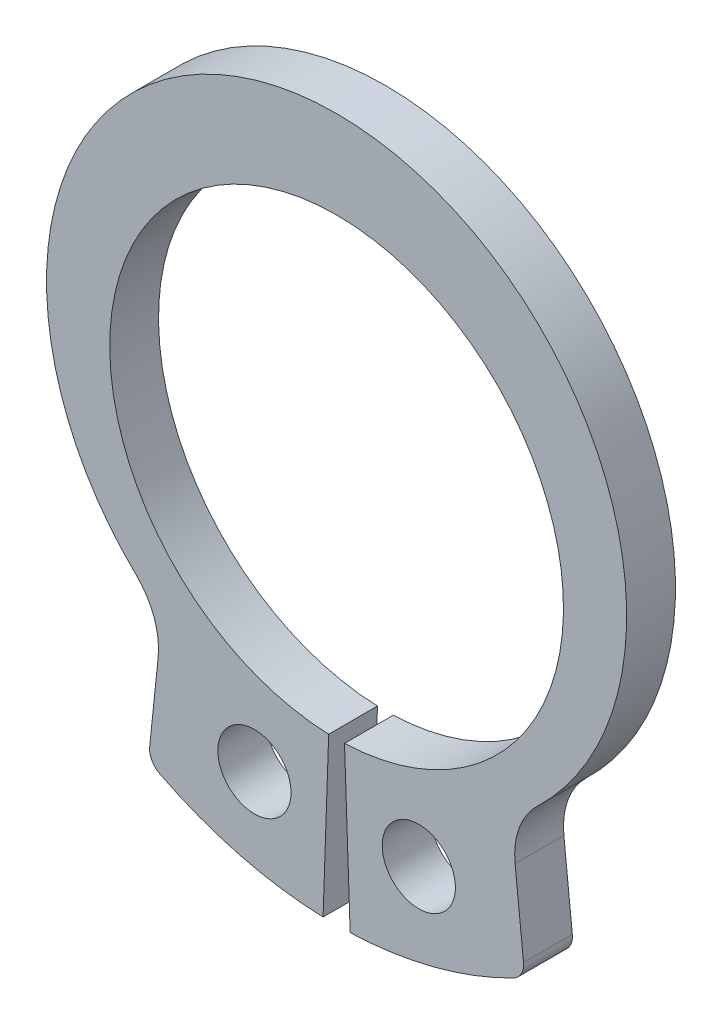
ISO-10303-21;
HEADER;
FILE_DESCRIPTION(('STEP AP214'),'2;1');
FILE_NAME('part.step','',(''),(''),'','','');
FILE_SCHEMA(('AUTOMOTIVE_DESIGN { 1 0 10303 214 1 1 1 1 }'));
ENDSEC;
DATA;
#1=APPLICATION_CONTEXT('core data for automotive mechanical design processes');
#2=APPLICATION_PROTOCOL_DEFINITION('international standard','automotive_design',2000,#1);
#3=PRODUCT_CONTEXT('',#1,'mechanical');
#4=PRODUCT('Part','Part','',(#3));
#5=PRODUCT_RELATED_PRODUCT_CATEGORY('part','',(#4));
#6=PRODUCT_DEFINITION_FORMATION('','',#4);
#7=PRODUCT_DEFINITION_CONTEXT('part definition',#1,'design');
#8=PRODUCT_DEFINITION('design','',#6,#7);
#9=PRODUCT_DEFINITION_SHAPE('','',#8);
#10=(LENGTH_UNIT() NAMED_UNIT(*) SI_UNIT(.MILLI.,.METRE.));
#11=(NAMED_UNIT(*) PLANE_ANGLE_UNIT() SI_UNIT($,.RADIAN.));
#12=(NAMED_UNIT(*) SI_UNIT($,.STERADIAN.) SOLID_ANGLE_UNIT());
#13=UNCERTAINTY_MEASURE_WITH_UNIT(LENGTH_MEASURE(1.E-05),#10,'distance_accuracy_value','');
#14=(GEOMETRIC_REPRESENTATION_CONTEXT(3) GLOBAL_UNCERTAINTY_ASSIGNED_CONTEXT((#13)) GLOBAL_UNIT_ASSIGNED_CONTEXT((#10,
#11,#12)) REPRESENTATION_CONTEXT('',''));
#15=CARTESIAN_POINT('',(0.,0.,0.));
#16=DIRECTION('',(0.,0.,1.));
#17=DIRECTION('',(1.,0.,0.));
#18=AXIS2_PLACEMENT_3D('',#15,#16,#17);
#19=CARTESIAN_POINT('',(0.,0.504934327126125,0.5));
#20=DIRECTION('',(0.,0.,1.));
#21=DIRECTION('',(1.,0.,0.));
#22=AXIS2_PLACEMENT_3D('',#19,#20,#21);
#23=PLANE('',#22);
#24=DIRECTION('',(-0.103368899881564,-0.994643087010248,0.));
#25=VECTOR('',#24,1.);
#26=CARTESIAN_POINT('',(-3.85778152735849,-6.95680203949989,0.5));
#27=LINE('',#26,#25);
#28=CARTESIAN_POINT('',(-3.65800533614776,-5.03450231719795,0.5));
#29=VERTEX_POINT('',#28);
#30=CARTESIAN_POINT('',(-3.83145228244631,-6.70345503214944,0.5));
#31=VERTEX_POINT('',#30);
#32=EDGE_CURVE('E193',#29,#31,#27,.T.);
#33=ORIENTED_EDGE('',*,*,#32,.T.);
#34=CARTESIAN_POINT('',(-3.45480058824215,-6.74259879313957,0.5));
#35=DIRECTION('',(0.,0.,1.));
#36=DIRECTION('',(1.,0.,0.));
#37=AXIS2_PLACEMENT_3D('',#34,#35,#36);
#38=CIRCLE('',#37,0.378680251361645);
#39=CARTESIAN_POINT('',(-3.62748223483951,-7.07961478934708,0.5));
#40=VERTEX_POINT('',#39);
#41=EDGE_CURVE('E12',#31,#40,#38,.T.);
#42=ORIENTED_EDGE('',*,*,#41,.T.);
#43=CARTESIAN_POINT('',(0.,0.,0.5));
#44=DIRECTION('',(0.,0.,1.));
#45=DIRECTION('',(1.,0.,0.));
#46=AXIS2_PLACEMENT_3D('',#43,#44,#45);
#47=CIRCLE('',#46,7.95484587717564);
#48=CARTESIAN_POINT('',(-0.277620117459407,-7.95,0.5));
#49=VERTEX_POINT('',#48);
#50=EDGE_CURVE('E196',#40,#49,#47,.T.);
#51=ORIENTED_EDGE('',*,*,#50,.T.);
#52=DIRECTION('',(0.0348994967025024,0.999390827019096,0.));
#53=VECTOR('',#52,1.);
#54=CARTESIAN_POINT('',(-0.277620117459407,-7.95,0.5));
#55=LINE('',#54,#53);
#56=CARTESIAN_POINT('',(-0.162282659666637,-4.6471673456388,0.5));
#57=VERTEX_POINT('',#56);
#58=EDGE_CURVE('E198',#49,#57,#55,.T.);
#59=ORIENTED_EDGE('',*,*,#58,.T.);
#60=CARTESIAN_POINT('',(0.,0.,0.5));
#61=DIRECTION('',(0.,0.,-1.));
#62=DIRECTION('',(1.,0.,0.));
#63=AXIS2_PLACEMENT_3D('',#60,#61,#62);
#64=CIRCLE('',#63,4.65);
#65=CARTESIAN_POINT('',(0.162282659666635,-4.6471673456388,0.5));
#66=VERTEX_POINT('',#65);
#67=EDGE_CURVE('E152',#57,#66,#64,.T.);
#68=ORIENTED_EDGE('',*,*,#67,.T.);
#69=DIRECTION('',(-0.034899496702502,0.999390827019096,0.));
#70=VECTOR('',#69,1.);
#71=CARTESIAN_POINT('',(0.277620117459404,-7.95,0.5));
#72=LINE('',#71,#70);
#73=CARTESIAN_POINT('',(0.277620117459404,-7.95,0.5));
#74=VERTEX_POINT('',#73);
#75=EDGE_CURVE('E132',#74,#66,#72,.T.);
#76=ORIENTED_EDGE('',*,*,#75,.F.);
#77=CARTESIAN_POINT('',(0.,0.,0.5));
#78=DIRECTION('',(0.,0.,-1.));
#79=DIRECTION('',(-1.,0.,0.));
#80=AXIS2_PLACEMENT_3D('',#77,#78,#79);
#81=CIRCLE('',#80,7.95484587717564);
#82=CARTESIAN_POINT('',(3.6274822348395,-7.07961478934709,0.5));
#83=VERTEX_POINT('',#82);
#84=EDGE_CURVE('E142',#83,#74,#81,.T.);
#85=ORIENTED_EDGE('',*,*,#84,.F.);
#86=CARTESIAN_POINT('',(3.45480058824214,-6.74259879313957,0.5));
#87=DIRECTION('',(0.,0.,-1.));
#88=DIRECTION('',(-1.,0.,0.));
#89=AXIS2_PLACEMENT_3D('',#86,#87,#88);
#90=CIRCLE('',#89,0.378680251361645);
#91=CARTESIAN_POINT('',(3.83145228244631,-6.70345503214945,0.5));
#92=VERTEX_POINT('',#91);
#93=EDGE_CURVE('E181',#92,#83,#90,.T.);
#94=ORIENTED_EDGE('',*,*,#93,.F.);
#95=DIRECTION('',(0.103368899881564,-0.994643087010248,0.));
#96=VECTOR('',#95,1.);
#97=CARTESIAN_POINT('',(3.85778152735849,-6.95680203949989,0.5));
#98=LINE('',#97,#96);
#99=CARTESIAN_POINT('',(3.65800533614776,-5.03450231719795,0.5));
#100=VERTEX_POINT('',#99);
#101=EDGE_CURVE('E148',#100,#92,#98,.T.);
#102=ORIENTED_EDGE('',*,*,#101,.F.);
#103=CARTESIAN_POINT('',(5.16461211296441,-4.87792727323744,0.5));
#104=DIRECTION('',(0.,0.,-1.));
#105=DIRECTION('',(-1.,0.,0.));
#106=AXIS2_PLACEMENT_3D('',#103,#104,#105);
#107=CIRCLE('',#106,1.51472100544658);
#108=CARTESIAN_POINT('',(4.11592978599842,-3.78492905665597,0.5));
#109=VERTEX_POINT('',#108);
#110=EDGE_CURVE('E172',#109,#100,#107,.F.);
#111=ORIENTED_EDGE('',*,*,#110,.F.);
#112=CARTESIAN_POINT('',(0.,0.504934327126125,0.5));
#113=DIRECTION('',(0.,0.,1.));
#114=DIRECTION('',(1.,0.,0.));
#115=AXIS2_PLACEMENT_3D('',#112,#113,#114);
#116=CIRCLE('',#115,5.94506567287388);
#117=CARTESIAN_POINT('',(-4.11592978599842,-3.78492905665597,0.5));
#118=VERTEX_POINT('',#117);
#119=EDGE_CURVE('E190',#109,#118,#116,.T.);
#120=ORIENTED_EDGE('',*,*,#119,.T.);
#121=CARTESIAN_POINT('',(-5.16461211296442,-4.87792727323744,0.5));
#122=DIRECTION('',(0.,0.,1.));
#123=DIRECTION('',(1.,0.,0.));
#124=AXIS2_PLACEMENT_3D('',#121,#122,#123);
#125=CIRCLE('',#124,1.51472100544658);
#126=EDGE_CURVE('E223',#118,#29,#125,.F.);
#127=ORIENTED_EDGE('',*,*,#126,.T.);
#128=EDGE_LOOP('',(#33,#42,#51,#59,#68,#76,#85,#94,#102,#111,#120,#127));
#129=FACE_BOUND('',#128,.T.);
#130=CARTESIAN_POINT('',(-1.68477116451144,-6.0730619147238,0.5));
#131=DIRECTION('',(0.,0.,1.));
#132=DIRECTION('',(1.,0.,0.));
#133=AXIS2_PLACEMENT_3D('',#130,#131,#132);
#134=CIRCLE('',#133,0.75);
#135=CARTESIAN_POINT('',(-0.934771164511438,-6.0730619147238,0.5));
#136=VERTEX_POINT('',#135);
#137=EDGE_CURVE('E184',#136,#136,#134,.T.);
#138=ORIENTED_EDGE('',*,*,#137,.F.);
#139=EDGE_LOOP('',(#138));
#140=FACE_BOUND('',#139,.T.);
#141=CARTESIAN_POINT('',(1.68477116451144,-6.0730619147238,0.5));
#142=DIRECTION('',(0.,0.,-1.));
#143=DIRECTION('',(-1.,0.,0.));
#144=AXIS2_PLACEMENT_3D('',#141,#142,#143);
#145=CIRCLE('',#144,0.75);
#146=CARTESIAN_POINT('',(0.934771164511436,-6.0730619147238,0.5));
#147=VERTEX_POINT('',#146);
#148=EDGE_CURVE('E162',#147,#147,#145,.T.);
#149=ORIENTED_EDGE('',*,*,#148,.T.);
#150=EDGE_LOOP('',(#149));
#151=FACE_BOUND('',#150,.T.);
#152=ADVANCED_FACE('F38',(#129,#140,#151),#23,.T.);
#153=CARTESIAN_POINT('',(0.,0.504934327126125,-0.5));
#154=DIRECTION('',(0.,0.,1.));
#155=DIRECTION('',(1.,0.,0.));
#156=AXIS2_PLACEMENT_3D('',#153,#154,#155);
#157=PLANE('',#156);
#158=CARTESIAN_POINT('',(0.,0.,-0.5));
#159=DIRECTION('',(0.,0.,1.));
#160=DIRECTION('',(1.,0.,0.));
#161=AXIS2_PLACEMENT_3D('',#158,#159,#160);
#162=CIRCLE('',#161,7.95484587717564);
#163=CARTESIAN_POINT('',(-3.62748223483951,-7.07961478934708,-0.5));
#164=VERTEX_POINT('',#163);
#165=CARTESIAN_POINT('',(-0.277620117459407,-7.95,-0.5));
#166=VERTEX_POINT('',#165);
#167=EDGE_CURVE('E206',#164,#166,#162,.T.);
#168=ORIENTED_EDGE('',*,*,#167,.F.);
#169=CARTESIAN_POINT('',(-3.45480058824215,-6.74259879313957,-0.5));
#170=DIRECTION('',(0.,0.,1.));
#171=DIRECTION('',(1.,0.,0.));
#172=AXIS2_PLACEMENT_3D('',#169,#170,#171);
#173=CIRCLE('',#172,0.378680251361645);
#174=CARTESIAN_POINT('',(-3.83145228244631,-6.70345503214944,-0.5));
#175=VERTEX_POINT('',#174);
#176=EDGE_CURVE('E60',#164,#175,#173,.F.);
#177=ORIENTED_EDGE('',*,*,#176,.T.);
#178=DIRECTION('',(-0.103368899881564,-0.994643087010248,0.));
#179=VECTOR('',#178,1.);
#180=CARTESIAN_POINT('',(-3.85778152735849,-6.95680203949989,-0.5));
#181=LINE('',#180,#179);
#182=CARTESIAN_POINT('',(-3.65800533614776,-5.03450231719795,-0.5));
#183=VERTEX_POINT('',#182);
#184=EDGE_CURVE('E204',#183,#175,#181,.T.);
#185=ORIENTED_EDGE('',*,*,#184,.F.);
#186=CARTESIAN_POINT('',(-5.16461211296442,-4.87792727323744,-0.5));
#187=DIRECTION('',(0.,0.,1.));
#188=DIRECTION('',(1.,0.,0.));
#189=AXIS2_PLACEMENT_3D('',#186,#187,#188);
#190=CIRCLE('',#189,1.51472100544658);
#191=CARTESIAN_POINT('',(-4.11592978599842,-3.78492905665597,-0.5));
#192=VERTEX_POINT('',#191);
#193=EDGE_CURVE('E221',#183,#192,#190,.T.);
#194=ORIENTED_EDGE('',*,*,#193,.T.);
#195=CARTESIAN_POINT('',(0.,0.504934327126125,-0.5));
#196=DIRECTION('',(0.,0.,1.));
#197=DIRECTION('',(1.,0.,0.));
#198=AXIS2_PLACEMENT_3D('',#195,#196,#197);
#199=CIRCLE('',#198,5.94506567287388);
#200=CARTESIAN_POINT('',(4.11592978599842,-3.78492905665597,-0.5));
#201=VERTEX_POINT('',#200);
#202=EDGE_CURVE('E187',#201,#192,#199,.T.);
#203=ORIENTED_EDGE('',*,*,#202,.F.);
#204=CARTESIAN_POINT('',(5.16461211296441,-4.87792727323744,-0.5));
#205=DIRECTION('',(0.,0.,-1.));
#206=DIRECTION('',(-1.,0.,0.));
#207=AXIS2_PLACEMENT_3D('',#204,#205,#206);
#208=CIRCLE('',#207,1.51472100544658);
#209=CARTESIAN_POINT('',(3.65800533614776,-5.03450231719795,-0.5));
#210=VERTEX_POINT('',#209);
#211=EDGE_CURVE('E169',#210,#201,#208,.T.);
#212=ORIENTED_EDGE('',*,*,#211,.F.);
#213=DIRECTION('',(0.103368899881564,-0.994643087010248,0.));
#214=VECTOR('',#213,1.);
#215=CARTESIAN_POINT('',(3.85778152735849,-6.95680203949989,-0.5));
#216=LINE('',#215,#214);
#217=CARTESIAN_POINT('',(3.83145228244631,-6.70345503214945,-0.5));
#218=VERTEX_POINT('',#217);
#219=EDGE_CURVE('E158',#210,#218,#216,.T.);
#220=ORIENTED_EDGE('',*,*,#219,.T.);
#221=CARTESIAN_POINT('',(3.45480058824214,-6.74259879313957,-0.5));
#222=DIRECTION('',(0.,0.,-1.));
#223=DIRECTION('',(-1.,0.,0.));
#224=AXIS2_PLACEMENT_3D('',#221,#222,#223);
#225=CIRCLE('',#224,0.378680251361645);
#226=CARTESIAN_POINT('',(3.6274822348395,-7.07961478934709,-0.5));
#227=VERTEX_POINT('',#226);
#228=EDGE_CURVE('E176',#227,#218,#225,.F.);
#229=ORIENTED_EDGE('',*,*,#228,.F.);
#230=CARTESIAN_POINT('',(0.,0.,-0.5));
#231=DIRECTION('',(0.,0.,-1.));
#232=DIRECTION('',(-1.,0.,0.));
#233=AXIS2_PLACEMENT_3D('',#230,#231,#232);
#234=CIRCLE('',#233,7.95484587717564);
#235=CARTESIAN_POINT('',(0.277620117459404,-7.95,-0.5));
#236=VERTEX_POINT('',#235);
#237=EDGE_CURVE('E161',#227,#236,#234,.T.);
#238=ORIENTED_EDGE('',*,*,#237,.T.);
#239=DIRECTION('',(-0.034899496702502,0.999390827019096,0.));
#240=VECTOR('',#239,1.);
#241=CARTESIAN_POINT('',(0.277620117459404,-7.95,-0.5));
#242=LINE('',#241,#240);
#243=CARTESIAN_POINT('',(0.162282659666635,-4.6471673456388,-0.5));
#244=VERTEX_POINT('',#243);
#245=EDGE_CURVE('E134',#236,#244,#242,.T.);
#246=ORIENTED_EDGE('',*,*,#245,.T.);
#247=CARTESIAN_POINT('',(0.,0.,-0.5));
#248=DIRECTION('',(0.,0.,-1.));
#249=DIRECTION('',(1.,0.,0.));
#250=AXIS2_PLACEMENT_3D('',#247,#248,#249);
#251=CIRCLE('',#250,4.65);
#252=CARTESIAN_POINT('',(-0.162282659666637,-4.6471673456388,-0.5));
#253=VERTEX_POINT('',#252);
#254=EDGE_CURVE('E194',#253,#244,#251,.T.);
#255=ORIENTED_EDGE('',*,*,#254,.F.);
#256=DIRECTION('',(0.0348994967025024,0.999390827019096,0.));
#257=VECTOR('',#256,1.);
#258=CARTESIAN_POINT('',(-0.277620117459407,-7.95,-0.5));
#259=LINE('',#258,#257);
#260=EDGE_CURVE('E208',#166,#253,#259,.T.);
#261=ORIENTED_EDGE('',*,*,#260,.F.);
#262=EDGE_LOOP('',(#168,#177,#185,#194,#203,#212,#220,#229,#238,#246,#255,#261));
#263=FACE_BOUND('',#262,.T.);
#264=CARTESIAN_POINT('',(-1.68477116451144,-6.0730619147238,-0.5));
#265=DIRECTION('',(0.,0.,1.));
#266=DIRECTION('',(1.,0.,0.));
#267=AXIS2_PLACEMENT_3D('',#264,#265,#266);
#268=CIRCLE('',#267,0.75);
#269=CARTESIAN_POINT('',(-0.934771164511438,-6.0730619147238,-0.5));
#270=VERTEX_POINT('',#269);
#271=EDGE_CURVE('E183',#270,#270,#268,.T.);
#272=ORIENTED_EDGE('',*,*,#271,.T.);
#273=EDGE_LOOP('',(#272));
#274=FACE_BOUND('',#273,.T.);
#275=CARTESIAN_POINT('',(1.68477116451144,-6.0730619147238,-0.5));
#276=DIRECTION('',(0.,0.,-1.));
#277=DIRECTION('',(-1.,0.,0.));
#278=AXIS2_PLACEMENT_3D('',#275,#276,#277);
#279=CIRCLE('',#278,0.75);
#280=CARTESIAN_POINT('',(0.934771164511436,-6.0730619147238,-0.5));
#281=VERTEX_POINT('',#280);
#282=EDGE_CURVE('E256',#281,#281,#279,.T.);
#283=ORIENTED_EDGE('',*,*,#282,.F.);
#284=EDGE_LOOP('',(#283));
#285=FACE_BOUND('',#284,.T.);
#286=ADVANCED_FACE('F236',(#263,#274,#285),#157,.F.);
#287=CARTESIAN_POINT('',(0.,0.504934327126125,0.5));
#288=DIRECTION('',(0.,0.,-1.));
#289=DIRECTION('',(-1.,0.,0.));
#290=AXIS2_PLACEMENT_3D('',#287,#288,#289);
#291=CYLINDRICAL_SURFACE('',#290,5.94506567287388);
#292=ORIENTED_EDGE('',*,*,#202,.T.);
#293=DIRECTION('',(0.,0.,-1.));
#294=VECTOR('',#293,1.);
#295=CARTESIAN_POINT('',(-4.11592978599842,-3.78492905665597,0.5));
#296=LINE('',#295,#294);
#297=EDGE_CURVE('E219',#192,#118,#296,.F.);
#298=ORIENTED_EDGE('',*,*,#297,.T.);
#299=ORIENTED_EDGE('',*,*,#119,.F.);
#300=DIRECTION('',(0.,0.,-1.));
#301=VECTOR('',#300,1.);
#302=CARTESIAN_POINT('',(4.11592978599842,-3.78492905665597,0.5));
#303=LINE('',#302,#301);
#304=EDGE_CURVE('E166',#201,#109,#303,.F.);
#305=ORIENTED_EDGE('',*,*,#304,.F.);
#306=EDGE_LOOP('',(#292,#298,#299,#305));
#307=FACE_BOUND('',#306,.T.);
#308=ADVANCED_FACE('F271',(#307),#291,.T.);
#309=CARTESIAN_POINT('',(-3.85778152735849,-6.95680203949989,0.5));
#310=DIRECTION('',(0.994643087010248,-0.103368899881564,0.));
#311=DIRECTION('',(0.103368899881564,0.994643087010248,0.));
#312=AXIS2_PLACEMENT_3D('',#309,#310,#311);
#313=PLANE('',#312);
#314=ORIENTED_EDGE('',*,*,#184,.T.);
#315=DIRECTION('',(0.,0.,-1.));
#316=VECTOR('',#315,1.);
#317=CARTESIAN_POINT('',(-3.83145228244631,-6.70345503214944,0.5));
#318=LINE('',#317,#316);
#319=EDGE_CURVE('E46',#175,#31,#318,.F.);
#320=ORIENTED_EDGE('',*,*,#319,.T.);
#321=ORIENTED_EDGE('',*,*,#32,.F.);
#322=DIRECTION('',(0.,0.,1.));
#323=VECTOR('',#322,1.);
#324=CARTESIAN_POINT('',(-3.65800533614776,-5.03450231719795,-0.5));
#325=LINE('',#324,#323);
#326=EDGE_CURVE('E216',#29,#183,#325,.F.);
#327=ORIENTED_EDGE('',*,*,#326,.T.);
#328=EDGE_LOOP('',(#314,#320,#321,#327));
#329=FACE_BOUND('',#328,.T.);
#330=ADVANCED_FACE('F277',(#329),#313,.F.);
#331=CARTESIAN_POINT('',(0.,0.,0.5));
#332=DIRECTION('',(0.,0.,-1.));
#333=DIRECTION('',(-1.,0.,0.));
#334=AXIS2_PLACEMENT_3D('',#331,#332,#333);
#335=CYLINDRICAL_SURFACE('',#334,7.95484587717564);
#336=ORIENTED_EDGE('',*,*,#50,.F.);
#337=DIRECTION('',(0.,0.,-1.));
#338=VECTOR('',#337,1.);
#339=CARTESIAN_POINT('',(-3.62748223483951,-7.07961478934709,0.5));
#340=LINE('',#339,#338);
#341=EDGE_CURVE('E225',#40,#164,#340,.T.);
#342=ORIENTED_EDGE('',*,*,#341,.T.);
#343=ORIENTED_EDGE('',*,*,#167,.T.);
#344=DIRECTION('',(0.,0.,-1.));
#345=VECTOR('',#344,1.);
#346=CARTESIAN_POINT('',(-0.277620117459407,-7.95,0.5));
#347=LINE('',#346,#345);
#348=EDGE_CURVE('E213',#49,#166,#347,.T.);
#349=ORIENTED_EDGE('',*,*,#348,.F.);
#350=EDGE_LOOP('',(#336,#342,#343,#349));
#351=FACE_BOUND('',#350,.T.);
#352=ADVANCED_FACE('F231',(#351),#335,.T.);
#353=CARTESIAN_POINT('',(-0.277620117459407,-7.95,0.5));
#354=DIRECTION('',(-0.999390827019096,0.0348994967025024,0.));
#355=DIRECTION('',(-0.0348994967025024,-0.999390827019096,0.));
#356=AXIS2_PLACEMENT_3D('',#353,#354,#355);
#357=PLANE('',#356);
#358=ORIENTED_EDGE('',*,*,#260,.T.);
#359=DIRECTION('',(0.,0.,-1.));
#360=VECTOR('',#359,1.);
#361=CARTESIAN_POINT('',(-0.162282659666637,-4.6471673456388,0.5));
#362=LINE('',#361,#360);
#363=EDGE_CURVE('E201',#57,#253,#362,.T.);
#364=ORIENTED_EDGE('',*,*,#363,.F.);
#365=ORIENTED_EDGE('',*,*,#58,.F.);
#366=ORIENTED_EDGE('',*,*,#348,.T.);
#367=EDGE_LOOP('',(#358,#364,#365,#366));
#368=FACE_BOUND('',#367,.T.);
#369=ADVANCED_FACE('F241',(#368),#357,.F.);
#370=CARTESIAN_POINT('',(0.,0.,0.5));
#371=DIRECTION('',(0.,0.,-1.));
#372=DIRECTION('',(-1.,0.,0.));
#373=AXIS2_PLACEMENT_3D('',#370,#371,#372);
#374=CYLINDRICAL_SURFACE('',#373,4.65);
#375=ORIENTED_EDGE('',*,*,#254,.T.);
#376=DIRECTION('',(0.,0.,-1.));
#377=VECTOR('',#376,1.);
#378=CARTESIAN_POINT('',(0.162282659666635,-4.6471673456388,0.5));
#379=LINE('',#378,#377);
#380=EDGE_CURVE('E139',#66,#244,#379,.T.);
#381=ORIENTED_EDGE('',*,*,#380,.F.);
#382=ORIENTED_EDGE('',*,*,#67,.F.);
#383=ORIENTED_EDGE('',*,*,#363,.T.);
#384=EDGE_LOOP('',(#375,#381,#382,#383));
#385=FACE_BOUND('',#384,.T.);
#386=ADVANCED_FACE('F244',(#385),#374,.F.);
#387=CARTESIAN_POINT('',(-1.68477116451144,-6.0730619147238,0.5));
#388=DIRECTION('',(0.,0.,-1.));
#389=DIRECTION('',(-1.,0.,0.));
#390=AXIS2_PLACEMENT_3D('',#387,#388,#389);
#391=CYLINDRICAL_SURFACE('',#390,0.75);
#392=ORIENTED_EDGE('',*,*,#137,.T.);
#393=EDGE_LOOP('',(#392));
#394=FACE_BOUND('',#393,.T.);
#395=ORIENTED_EDGE('',*,*,#271,.F.);
#396=EDGE_LOOP('',(#395));
#397=FACE_BOUND('',#396,.T.);
#398=ADVANCED_FACE('F285',(#394,#397),#391,.F.);
#399=CARTESIAN_POINT('',(-5.16461211296442,-4.87792727323744,0.5));
#400=DIRECTION('',(0.,0.,-1.));
#401=DIRECTION('',(-1.,0.,0.));
#402=AXIS2_PLACEMENT_3D('',#399,#400,#401);
#403=CYLINDRICAL_SURFACE('',#402,1.51472100544658);
#404=ORIENTED_EDGE('',*,*,#126,.F.);
#405=ORIENTED_EDGE('',*,*,#297,.F.);
#406=ORIENTED_EDGE('',*,*,#193,.F.);
#407=ORIENTED_EDGE('',*,*,#326,.F.);
#408=EDGE_LOOP('',(#404,#405,#406,#407));
#409=FACE_BOUND('',#408,.T.);
#410=ADVANCED_FACE('F291',(#409),#403,.F.);
#411=CARTESIAN_POINT('',(-3.45480058824215,-6.74259879313957,0.5));
#412=DIRECTION('',(0.,0.,-1.));
#413=DIRECTION('',(-1.,0.,0.));
#414=AXIS2_PLACEMENT_3D('',#411,#412,#413);
#415=CYLINDRICAL_SURFACE('',#414,0.378680251361645);
#416=ORIENTED_EDGE('',*,*,#41,.F.);
#417=ORIENTED_EDGE('',*,*,#319,.F.);
#418=ORIENTED_EDGE('',*,*,#176,.F.);
#419=ORIENTED_EDGE('',*,*,#341,.F.);
#420=EDGE_LOOP('',(#416,#417,#418,#419));
#421=FACE_BOUND('',#420,.T.);
#422=ADVANCED_FACE('F40',(#421),#415,.T.);
#423=CARTESIAN_POINT('',(3.85778152735849,-6.95680203949989,0.5));
#424=DIRECTION('',(-0.994643087010248,-0.103368899881564,0.));
#425=DIRECTION('',(-0.103368899881564,0.994643087010248,0.));
#426=AXIS2_PLACEMENT_3D('',#423,#424,#425);
#427=PLANE('',#426);
#428=ORIENTED_EDGE('',*,*,#219,.F.);
#429=DIRECTION('',(0.,0.,1.));
#430=VECTOR('',#429,1.);
#431=CARTESIAN_POINT('',(3.65800533614776,-5.03450231719795,-0.5));
#432=LINE('',#431,#430);
#433=EDGE_CURVE('E138',#100,#210,#432,.F.);
#434=ORIENTED_EDGE('',*,*,#433,.F.);
#435=ORIENTED_EDGE('',*,*,#101,.T.);
#436=DIRECTION('',(0.,0.,-1.));
#437=VECTOR('',#436,1.);
#438=CARTESIAN_POINT('',(3.83145228244631,-6.70345503214945,0.5));
#439=LINE('',#438,#437);
#440=EDGE_CURVE('E179',#218,#92,#439,.F.);
#441=ORIENTED_EDGE('',*,*,#440,.F.);
#442=EDGE_LOOP('',(#428,#434,#435,#441));
#443=FACE_BOUND('',#442,.T.);
#444=ADVANCED_FACE('F254',(#443),#427,.F.);
#445=CARTESIAN_POINT('',(0.,0.,0.5));
#446=DIRECTION('',(0.,0.,-1.));
#447=DIRECTION('',(1.,0.,0.));
#448=AXIS2_PLACEMENT_3D('',#445,#446,#447);
#449=CYLINDRICAL_SURFACE('',#448,7.95484587717564);
#450=ORIENTED_EDGE('',*,*,#84,.T.);
#451=DIRECTION('',(0.,0.,-1.));
#452=VECTOR('',#451,1.);
#453=CARTESIAN_POINT('',(0.277620117459404,-7.95,0.5));
#454=LINE('',#453,#452);
#455=EDGE_CURVE('E127',#74,#236,#454,.T.);
#456=ORIENTED_EDGE('',*,*,#455,.T.);
#457=ORIENTED_EDGE('',*,*,#237,.F.);
#458=DIRECTION('',(0.,0.,-1.));
#459=VECTOR('',#458,1.);
#460=CARTESIAN_POINT('',(3.62748223483951,-7.07961478934709,0.5));
#461=LINE('',#460,#459);
#462=EDGE_CURVE('E144',#83,#227,#461,.T.);
#463=ORIENTED_EDGE('',*,*,#462,.F.);
#464=EDGE_LOOP('',(#450,#456,#457,#463));
#465=FACE_BOUND('',#464,.T.);
#466=ADVANCED_FACE('F143',(#465),#449,.T.);
#467=CARTESIAN_POINT('',(0.277620117459404,-7.95,0.5));
#468=DIRECTION('',(0.999390827019096,0.034899496702502,0.));
#469=DIRECTION('',(0.034899496702502,-0.999390827019096,0.));
#470=AXIS2_PLACEMENT_3D('',#467,#468,#469);
#471=PLANE('',#470);
#472=ORIENTED_EDGE('',*,*,#245,.F.);
#473=ORIENTED_EDGE('',*,*,#455,.F.);
#474=ORIENTED_EDGE('',*,*,#75,.T.);
#475=ORIENTED_EDGE('',*,*,#380,.T.);
#476=EDGE_LOOP('',(#472,#473,#474,#475));
#477=FACE_BOUND('',#476,.T.);
#478=ADVANCED_FACE('F129',(#477),#471,.F.);
#479=CARTESIAN_POINT('',(1.68477116451144,-6.0730619147238,0.5));
#480=DIRECTION('',(0.,0.,-1.));
#481=DIRECTION('',(1.,0.,0.));
#482=AXIS2_PLACEMENT_3D('',#479,#480,#481);
#483=CYLINDRICAL_SURFACE('',#482,0.75);
#484=ORIENTED_EDGE('',*,*,#148,.F.);
#485=EDGE_LOOP('',(#484));
#486=FACE_BOUND('',#485,.T.);
#487=ORIENTED_EDGE('',*,*,#282,.T.);
#488=EDGE_LOOP('',(#487));
#489=FACE_BOUND('',#488,.T.);
#490=ADVANCED_FACE('F263',(#486,#489),#483,.F.);
#491=CARTESIAN_POINT('',(5.16461211296441,-4.87792727323744,0.5));
#492=DIRECTION('',(0.,0.,-1.));
#493=DIRECTION('',(1.,0.,0.));
#494=AXIS2_PLACEMENT_3D('',#491,#492,#493);
#495=CYLINDRICAL_SURFACE('',#494,1.51472100544658);
#496=ORIENTED_EDGE('',*,*,#110,.T.);
#497=ORIENTED_EDGE('',*,*,#433,.T.);
#498=ORIENTED_EDGE('',*,*,#211,.T.);
#499=ORIENTED_EDGE('',*,*,#304,.T.);
#500=EDGE_LOOP('',(#496,#497,#498,#499));
#501=FACE_BOUND('',#500,.T.);
#502=ADVANCED_FACE('F266',(#501),#495,.F.);
#503=CARTESIAN_POINT('',(3.45480058824214,-6.74259879313957,0.5));
#504=DIRECTION('',(0.,0.,-1.));
#505=DIRECTION('',(1.,0.,0.));
#506=AXIS2_PLACEMENT_3D('',#503,#504,#505);
#507=CYLINDRICAL_SURFACE('',#506,0.378680251361645);
#508=ORIENTED_EDGE('',*,*,#93,.T.);
#509=ORIENTED_EDGE('',*,*,#462,.T.);
#510=ORIENTED_EDGE('',*,*,#228,.T.);
#511=ORIENTED_EDGE('',*,*,#440,.T.);
#512=EDGE_LOOP('',(#508,#509,#510,#511));
#513=FACE_BOUND('',#512,.T.);
#514=ADVANCED_FACE('F249',(#513),#507,.T.);
#515=CLOSED_SHELL('',(#152,#286,#308,#330,#352,#369,#386,#398,#410,#422,#444,#466,#478,#490,
#502,#514));
#516=MANIFOLD_SOLID_BREP('B2',#515);
#517=ADVANCED_BREP_SHAPE_REPRESENTATION('',(#18,#516),#14);
#518=SHAPE_DEFINITION_REPRESENTATION(#9,#517);
ENDSEC;
END-ISO-10303-21;
